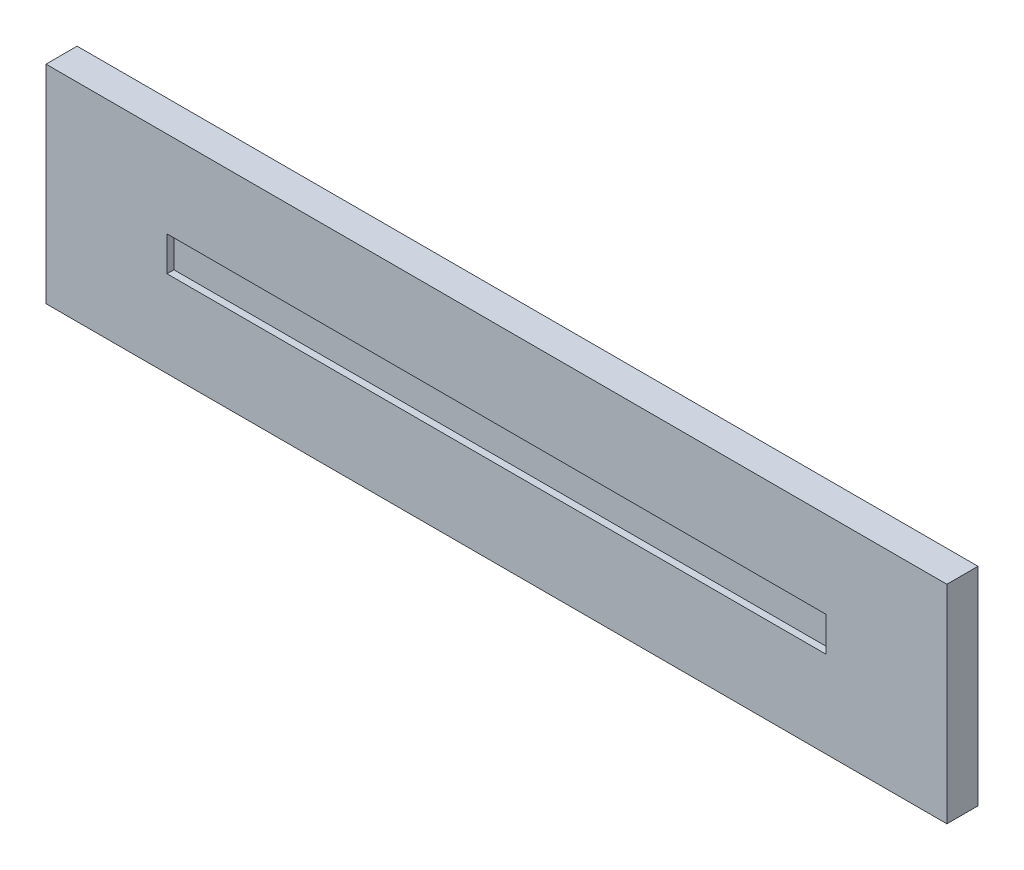
ISO-10303-21;
HEADER;
FILE_DESCRIPTION(('STEP AP214'),'2;1');
FILE_NAME('part.step','',(''),(''),'','','');
FILE_SCHEMA(('AUTOMOTIVE_DESIGN { 1 0 10303 214 1 1 1 1 }'));
ENDSEC;
DATA;
#1=APPLICATION_CONTEXT('core data for automotive mechanical design processes');
#2=APPLICATION_PROTOCOL_DEFINITION('international standard','automotive_design',2000,#1);
#3=PRODUCT_CONTEXT('',#1,'mechanical');
#4=PRODUCT('Part','Part','',(#3));
#5=PRODUCT_RELATED_PRODUCT_CATEGORY('part','',(#4));
#6=PRODUCT_DEFINITION_FORMATION('','',#4);
#7=PRODUCT_DEFINITION_CONTEXT('part definition',#1,'design');
#8=PRODUCT_DEFINITION('design','',#6,#7);
#9=PRODUCT_DEFINITION_SHAPE('','',#8);
#10=(LENGTH_UNIT() NAMED_UNIT(*) SI_UNIT(.MILLI.,.METRE.));
#11=(NAMED_UNIT(*) PLANE_ANGLE_UNIT() SI_UNIT($,.RADIAN.));
#12=(NAMED_UNIT(*) SI_UNIT($,.STERADIAN.) SOLID_ANGLE_UNIT());
#13=UNCERTAINTY_MEASURE_WITH_UNIT(LENGTH_MEASURE(1.E-05),#10,'distance_accuracy_value','');
#14=(GEOMETRIC_REPRESENTATION_CONTEXT(3) GLOBAL_UNCERTAINTY_ASSIGNED_CONTEXT((#13)) GLOBAL_UNIT_ASSIGNED_CONTEXT((#10,
#11,#12)) REPRESENTATION_CONTEXT('',''));
#15=CARTESIAN_POINT('',(0.,0.,0.));
#16=DIRECTION('',(0.,0.,1.));
#17=DIRECTION('',(1.,0.,0.));
#18=AXIS2_PLACEMENT_3D('',#15,#16,#17);
#19=CARTESIAN_POINT('',(260.5,60.,18.));
#20=DIRECTION('',(-1.,0.,0.));
#21=DIRECTION('',(0.,0.,1.));
#22=AXIS2_PLACEMENT_3D('',#19,#20,#21);
#23=PLANE('',#22);
#24=DIRECTION('',(0.,1.,0.));
#25=VECTOR('',#24,1.);
#26=CARTESIAN_POINT('',(260.5,60.,0.));
#27=LINE('',#26,#25);
#28=CARTESIAN_POINT('',(260.5,-60.,0.));
#29=VERTEX_POINT('',#28);
#30=CARTESIAN_POINT('',(260.5,60.,0.));
#31=VERTEX_POINT('',#30);
#32=EDGE_CURVE('E141',#29,#31,#27,.T.);
#33=ORIENTED_EDGE('',*,*,#32,.T.);
#34=DIRECTION('',(0.,0.,-1.));
#35=VECTOR('',#34,1.);
#36=CARTESIAN_POINT('',(260.5,60.,18.));
#37=LINE('',#36,#35);
#38=CARTESIAN_POINT('',(260.5,60.,18.));
#39=VERTEX_POINT('',#38);
#40=EDGE_CURVE('E11',#39,#31,#37,.T.);
#41=ORIENTED_EDGE('',*,*,#40,.F.);
#42=DIRECTION('',(0.,1.,0.));
#43=VECTOR('',#42,1.);
#44=CARTESIAN_POINT('',(260.5,60.,18.));
#45=LINE('',#44,#43);
#46=CARTESIAN_POINT('',(260.5,-60.,18.));
#47=VERTEX_POINT('',#46);
#48=EDGE_CURVE('E145',#47,#39,#45,.T.);
#49=ORIENTED_EDGE('',*,*,#48,.F.);
#50=DIRECTION('',(0.,0.,-1.));
#51=VECTOR('',#50,1.);
#52=CARTESIAN_POINT('',(260.5,-60.,18.));
#53=LINE('',#52,#51);
#54=EDGE_CURVE('E151',#47,#29,#53,.T.);
#55=ORIENTED_EDGE('',*,*,#54,.T.);
#56=EDGE_LOOP('',(#33,#41,#49,#55));
#57=FACE_BOUND('',#56,.T.);
#58=ADVANCED_FACE('F33',(#57),#23,.F.);
#59=CARTESIAN_POINT('',(-260.5,60.,18.));
#60=DIRECTION('',(0.,-1.,0.));
#61=DIRECTION('',(0.,0.,-1.));
#62=AXIS2_PLACEMENT_3D('',#59,#60,#61);
#63=PLANE('',#62);
#64=DIRECTION('',(-1.,0.,0.));
#65=VECTOR('',#64,1.);
#66=CARTESIAN_POINT('',(-260.5,60.,0.));
#67=LINE('',#66,#65);
#68=CARTESIAN_POINT('',(-260.5,60.,0.));
#69=VERTEX_POINT('',#68);
#70=EDGE_CURVE('E154',#31,#69,#67,.T.);
#71=ORIENTED_EDGE('',*,*,#70,.T.);
#72=DIRECTION('',(0.,0.,-1.));
#73=VECTOR('',#72,1.);
#74=CARTESIAN_POINT('',(-260.5,60.,18.));
#75=LINE('',#74,#73);
#76=CARTESIAN_POINT('',(-260.5,60.,18.));
#77=VERTEX_POINT('',#76);
#78=EDGE_CURVE('E40',#77,#69,#75,.T.);
#79=ORIENTED_EDGE('',*,*,#78,.F.);
#80=DIRECTION('',(-1.,0.,0.));
#81=VECTOR('',#80,1.);
#82=CARTESIAN_POINT('',(-260.5,60.,18.));
#83=LINE('',#82,#81);
#84=EDGE_CURVE('E84',#39,#77,#83,.T.);
#85=ORIENTED_EDGE('',*,*,#84,.F.);
#86=ORIENTED_EDGE('',*,*,#40,.T.);
#87=EDGE_LOOP('',(#71,#79,#85,#86));
#88=FACE_BOUND('',#87,.T.);
#89=ADVANCED_FACE('F183',(#88),#63,.F.);
#90=CARTESIAN_POINT('',(-260.5,60.,18.));
#91=DIRECTION('',(1.,0.,0.));
#92=DIRECTION('',(0.,0.,-1.));
#93=AXIS2_PLACEMENT_3D('',#90,#91,#92);
#94=PLANE('',#93);
#95=DIRECTION('',(0.,-1.,0.));
#96=VECTOR('',#95,1.);
#97=CARTESIAN_POINT('',(-260.5,60.,0.));
#98=LINE('',#97,#96);
#99=CARTESIAN_POINT('',(-260.5,-60.,0.));
#100=VERTEX_POINT('',#99);
#101=EDGE_CURVE('E156',#69,#100,#98,.T.);
#102=ORIENTED_EDGE('',*,*,#101,.T.);
#103=DIRECTION('',(0.,0.,-1.));
#104=VECTOR('',#103,1.);
#105=CARTESIAN_POINT('',(-260.5,-60.,18.));
#106=LINE('',#105,#104);
#107=CARTESIAN_POINT('',(-260.5,-60.,18.));
#108=VERTEX_POINT('',#107);
#109=EDGE_CURVE('E160',#108,#100,#106,.T.);
#110=ORIENTED_EDGE('',*,*,#109,.F.);
#111=DIRECTION('',(0.,-1.,0.));
#112=VECTOR('',#111,1.);
#113=CARTESIAN_POINT('',(-260.5,60.,18.));
#114=LINE('',#113,#112);
#115=EDGE_CURVE('E148',#77,#108,#114,.T.);
#116=ORIENTED_EDGE('',*,*,#115,.F.);
#117=ORIENTED_EDGE('',*,*,#78,.T.);
#118=EDGE_LOOP('',(#102,#110,#116,#117));
#119=FACE_BOUND('',#118,.T.);
#120=ADVANCED_FACE('F165',(#119),#94,.F.);
#121=CARTESIAN_POINT('',(-260.5,-60.,18.));
#122=DIRECTION('',(0.,1.,0.));
#123=DIRECTION('',(0.,0.,1.));
#124=AXIS2_PLACEMENT_3D('',#121,#122,#123);
#125=PLANE('',#124);
#126=DIRECTION('',(1.,0.,0.));
#127=VECTOR('',#126,1.);
#128=CARTESIAN_POINT('',(-260.5,-60.,0.));
#129=LINE('',#128,#127);
#130=EDGE_CURVE('E77',#100,#29,#129,.T.);
#131=ORIENTED_EDGE('',*,*,#130,.T.);
#132=ORIENTED_EDGE('',*,*,#54,.F.);
#133=DIRECTION('',(1.,0.,0.));
#134=VECTOR('',#133,1.);
#135=CARTESIAN_POINT('',(-260.5,-60.,18.));
#136=LINE('',#135,#134);
#137=EDGE_CURVE('E56',#108,#47,#136,.T.);
#138=ORIENTED_EDGE('',*,*,#137,.F.);
#139=ORIENTED_EDGE('',*,*,#109,.T.);
#140=EDGE_LOOP('',(#131,#132,#138,#139));
#141=FACE_BOUND('',#140,.T.);
#142=ADVANCED_FACE('F173',(#141),#125,.F.);
#143=CARTESIAN_POINT('',(0.,0.,18.));
#144=DIRECTION('',(0.,0.,1.));
#145=DIRECTION('',(1.,0.,0.));
#146=AXIS2_PLACEMENT_3D('',#143,#144,#145);
#147=PLANE('',#146);
#148=DIRECTION('',(0.,1.,0.));
#149=VECTOR('',#148,1.);
#150=CARTESIAN_POINT('',(190.5,-10.,18.));
#151=LINE('',#150,#149);
#152=CARTESIAN_POINT('',(190.5,-10.,18.));
#153=VERTEX_POINT('',#152);
#154=CARTESIAN_POINT('',(190.5,10.,18.));
#155=VERTEX_POINT('',#154);
#156=EDGE_CURVE('E47',#153,#155,#151,.T.);
#157=ORIENTED_EDGE('',*,*,#156,.F.);
#158=DIRECTION('',(1.,0.,0.));
#159=VECTOR('',#158,1.);
#160=CARTESIAN_POINT('',(-190.5,-10.,18.));
#161=LINE('',#160,#159);
#162=CARTESIAN_POINT('',(-190.5,-10.,18.));
#163=VERTEX_POINT('',#162);
#164=EDGE_CURVE('E126',#163,#153,#161,.T.);
#165=ORIENTED_EDGE('',*,*,#164,.F.);
#166=DIRECTION('',(0.,-1.,0.));
#167=VECTOR('',#166,1.);
#168=CARTESIAN_POINT('',(-190.5,-10.,18.));
#169=LINE('',#168,#167);
#170=CARTESIAN_POINT('',(-190.5,10.,18.));
#171=VERTEX_POINT('',#170);
#172=EDGE_CURVE('E129',#171,#163,#169,.T.);
#173=ORIENTED_EDGE('',*,*,#172,.F.);
#174=DIRECTION('',(-1.,0.,0.));
#175=VECTOR('',#174,1.);
#176=CARTESIAN_POINT('',(-190.5,10.,18.));
#177=LINE('',#176,#175);
#178=EDGE_CURVE('E135',#155,#171,#177,.T.);
#179=ORIENTED_EDGE('',*,*,#178,.F.);
#180=EDGE_LOOP('',(#157,#165,#173,#179));
#181=FACE_BOUND('',#180,.T.);
#182=ORIENTED_EDGE('',*,*,#48,.T.);
#183=ORIENTED_EDGE('',*,*,#84,.T.);
#184=ORIENTED_EDGE('',*,*,#115,.T.);
#185=ORIENTED_EDGE('',*,*,#137,.T.);
#186=EDGE_LOOP('',(#182,#183,#184,#185));
#187=FACE_BOUND('',#186,.T.);
#188=ADVANCED_FACE('F175',(#181,#187),#147,.T.);
#189=CARTESIAN_POINT('',(0.,0.,0.));
#190=DIRECTION('',(0.,0.,1.));
#191=DIRECTION('',(1.,0.,0.));
#192=AXIS2_PLACEMENT_3D('',#189,#190,#191);
#193=PLANE('',#192);
#194=ORIENTED_EDGE('',*,*,#32,.F.);
#195=ORIENTED_EDGE('',*,*,#130,.F.);
#196=ORIENTED_EDGE('',*,*,#101,.F.);
#197=ORIENTED_EDGE('',*,*,#70,.F.);
#198=EDGE_LOOP('',(#194,#195,#196,#197));
#199=FACE_BOUND('',#198,.T.);
#200=ADVANCED_FACE('F169',(#199),#193,.F.);
#201=CARTESIAN_POINT('',(190.5,-10.,14.));
#202=DIRECTION('',(1.,0.,0.));
#203=DIRECTION('',(0.,0.,-1.));
#204=AXIS2_PLACEMENT_3D('',#201,#202,#203);
#205=PLANE('',#204);
#206=ORIENTED_EDGE('',*,*,#156,.T.);
#207=DIRECTION('',(0.,0.,1.));
#208=VECTOR('',#207,1.);
#209=CARTESIAN_POINT('',(190.5,10.,14.));
#210=LINE('',#209,#208);
#211=CARTESIAN_POINT('',(190.5,10.,14.));
#212=VERTEX_POINT('',#211);
#213=EDGE_CURVE('E104',#212,#155,#210,.T.);
#214=ORIENTED_EDGE('',*,*,#213,.F.);
#215=DIRECTION('',(0.,1.,0.));
#216=VECTOR('',#215,1.);
#217=CARTESIAN_POINT('',(190.5,-10.,14.));
#218=LINE('',#217,#216);
#219=CARTESIAN_POINT('',(190.5,-10.,14.));
#220=VERTEX_POINT('',#219);
#221=EDGE_CURVE('E108',#220,#212,#218,.T.);
#222=ORIENTED_EDGE('',*,*,#221,.F.);
#223=DIRECTION('',(0.,0.,1.));
#224=VECTOR('',#223,1.);
#225=CARTESIAN_POINT('',(190.5,-10.,14.));
#226=LINE('',#225,#224);
#227=EDGE_CURVE('E139',#220,#153,#226,.T.);
#228=ORIENTED_EDGE('',*,*,#227,.T.);
#229=EDGE_LOOP('',(#206,#214,#222,#228));
#230=FACE_BOUND('',#229,.T.);
#231=ADVANCED_FACE('F106',(#230),#205,.F.);
#232=CARTESIAN_POINT('',(-190.5,-10.,14.));
#233=DIRECTION('',(0.,-1.,0.));
#234=DIRECTION('',(0.,0.,-1.));
#235=AXIS2_PLACEMENT_3D('',#232,#233,#234);
#236=PLANE('',#235);
#237=ORIENTED_EDGE('',*,*,#164,.T.);
#238=ORIENTED_EDGE('',*,*,#227,.F.);
#239=DIRECTION('',(1.,0.,0.));
#240=VECTOR('',#239,1.);
#241=CARTESIAN_POINT('',(-190.5,-10.,14.));
#242=LINE('',#241,#240);
#243=CARTESIAN_POINT('',(-190.5,-10.,14.));
#244=VERTEX_POINT('',#243);
#245=EDGE_CURVE('E114',#244,#220,#242,.T.);
#246=ORIENTED_EDGE('',*,*,#245,.F.);
#247=DIRECTION('',(0.,0.,1.));
#248=VECTOR('',#247,1.);
#249=CARTESIAN_POINT('',(-190.5,-10.,14.));
#250=LINE('',#249,#248);
#251=EDGE_CURVE('E142',#244,#163,#250,.T.);
#252=ORIENTED_EDGE('',*,*,#251,.T.);
#253=EDGE_LOOP('',(#237,#238,#246,#252));
#254=FACE_BOUND('',#253,.T.);
#255=ADVANCED_FACE('F222',(#254),#236,.F.);
#256=CARTESIAN_POINT('',(-190.5,-10.,14.));
#257=DIRECTION('',(-1.,0.,0.));
#258=DIRECTION('',(0.,0.,1.));
#259=AXIS2_PLACEMENT_3D('',#256,#257,#258);
#260=PLANE('',#259);
#261=ORIENTED_EDGE('',*,*,#172,.T.);
#262=ORIENTED_EDGE('',*,*,#251,.F.);
#263=DIRECTION('',(0.,-1.,0.));
#264=VECTOR('',#263,1.);
#265=CARTESIAN_POINT('',(-190.5,-10.,14.));
#266=LINE('',#265,#264);
#267=CARTESIAN_POINT('',(-190.5,10.,14.));
#268=VERTEX_POINT('',#267);
#269=EDGE_CURVE('E122',#268,#244,#266,.T.);
#270=ORIENTED_EDGE('',*,*,#269,.F.);
#271=DIRECTION('',(0.,0.,1.));
#272=VECTOR('',#271,1.);
#273=CARTESIAN_POINT('',(-190.5,10.,14.));
#274=LINE('',#273,#272);
#275=EDGE_CURVE('E113',#268,#171,#274,.T.);
#276=ORIENTED_EDGE('',*,*,#275,.T.);
#277=EDGE_LOOP('',(#261,#262,#270,#276));
#278=FACE_BOUND('',#277,.T.);
#279=ADVANCED_FACE('F231',(#278),#260,.F.);
#280=CARTESIAN_POINT('',(-190.5,10.,14.));
#281=DIRECTION('',(0.,1.,0.));
#282=DIRECTION('',(0.,0.,1.));
#283=AXIS2_PLACEMENT_3D('',#280,#281,#282);
#284=PLANE('',#283);
#285=ORIENTED_EDGE('',*,*,#178,.T.);
#286=ORIENTED_EDGE('',*,*,#275,.F.);
#287=DIRECTION('',(-1.,0.,0.));
#288=VECTOR('',#287,1.);
#289=CARTESIAN_POINT('',(-190.5,10.,14.));
#290=LINE('',#289,#288);
#291=EDGE_CURVE('E117',#212,#268,#290,.T.);
#292=ORIENTED_EDGE('',*,*,#291,.F.);
#293=ORIENTED_EDGE('',*,*,#213,.T.);
#294=EDGE_LOOP('',(#285,#286,#292,#293));
#295=FACE_BOUND('',#294,.T.);
#296=ADVANCED_FACE('F118',(#295),#284,.F.);
#297=CARTESIAN_POINT('',(0.,0.,14.));
#298=DIRECTION('',(0.,0.,-1.));
#299=DIRECTION('',(-1.,0.,0.));
#300=AXIS2_PLACEMENT_3D('',#297,#298,#299);
#301=PLANE('',#300);
#302=ORIENTED_EDGE('',*,*,#221,.T.);
#303=ORIENTED_EDGE('',*,*,#291,.T.);
#304=ORIENTED_EDGE('',*,*,#269,.T.);
#305=ORIENTED_EDGE('',*,*,#245,.T.);
#306=EDGE_LOOP('',(#302,#303,#304,#305));
#307=FACE_BOUND('',#306,.T.);
#308=ADVANCED_FACE('F124',(#307),#301,.F.);
#309=CLOSED_SHELL('',(#58,#89,#120,#142,#188,#200,#231,#255,#279,#296,#308));
#310=MANIFOLD_SOLID_BREP('B2',#309);
#311=ADVANCED_BREP_SHAPE_REPRESENTATION('',(#18,#310),#14);
#312=SHAPE_DEFINITION_REPRESENTATION(#9,#311);
ENDSEC;
END-ISO-10303-21;
